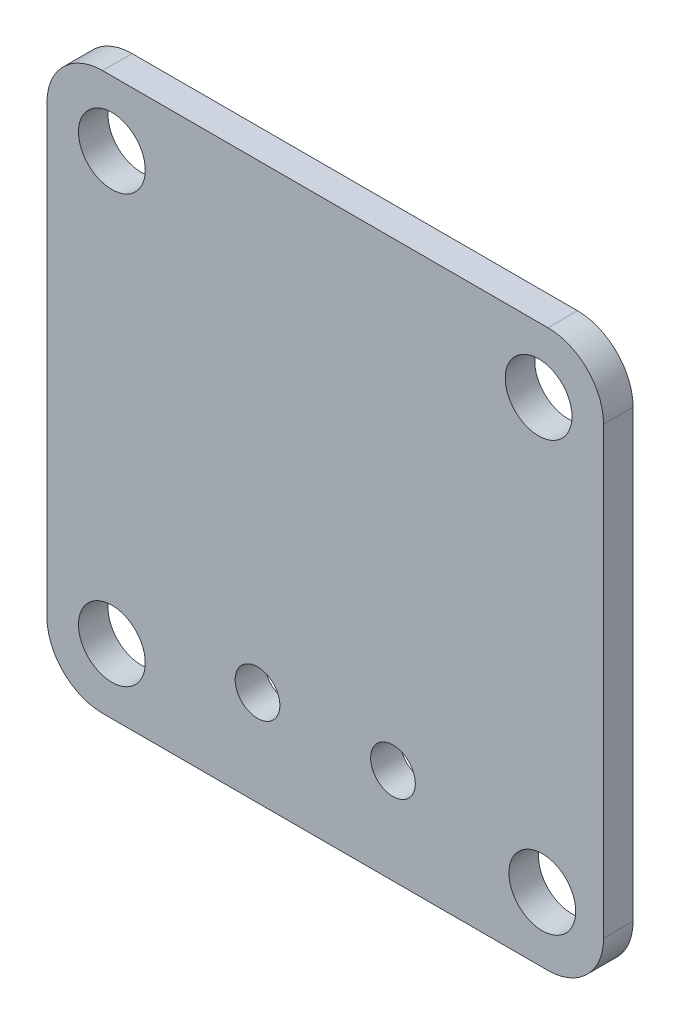
ISO-10303-21;
HEADER;
FILE_DESCRIPTION(('STEP AP214'),'2;1');
FILE_NAME('part.step','',(''),(''),'','','');
FILE_SCHEMA(('AUTOMOTIVE_DESIGN { 1 0 10303 214 1 1 1 1 }'));
ENDSEC;
DATA;
#1=APPLICATION_CONTEXT('core data for automotive mechanical design processes');
#2=APPLICATION_PROTOCOL_DEFINITION('international standard','automotive_design',2000,#1);
#3=PRODUCT_CONTEXT('',#1,'mechanical');
#4=PRODUCT('Part','Part','',(#3));
#5=PRODUCT_RELATED_PRODUCT_CATEGORY('part','',(#4));
#6=PRODUCT_DEFINITION_FORMATION('','',#4);
#7=PRODUCT_DEFINITION_CONTEXT('part definition',#1,'design');
#8=PRODUCT_DEFINITION('design','',#6,#7);
#9=PRODUCT_DEFINITION_SHAPE('','',#8);
#10=(LENGTH_UNIT() NAMED_UNIT(*) SI_UNIT(.MILLI.,.METRE.));
#11=(NAMED_UNIT(*) PLANE_ANGLE_UNIT() SI_UNIT($,.RADIAN.));
#12=(NAMED_UNIT(*) SI_UNIT($,.STERADIAN.) SOLID_ANGLE_UNIT());
#13=UNCERTAINTY_MEASURE_WITH_UNIT(LENGTH_MEASURE(1.E-05),#10,'distance_accuracy_value','');
#14=(GEOMETRIC_REPRESENTATION_CONTEXT(3) GLOBAL_UNCERTAINTY_ASSIGNED_CONTEXT((#13)) GLOBAL_UNIT_ASSIGNED_CONTEXT((#10,
#11,#12)) REPRESENTATION_CONTEXT('',''));
#15=CARTESIAN_POINT('',(0.,0.,0.));
#16=DIRECTION('',(0.,0.,1.));
#17=DIRECTION('',(1.,0.,0.));
#18=AXIS2_PLACEMENT_3D('',#15,#16,#17);
#19=CARTESIAN_POINT('',(79.,66.5,1.59143954));
#20=DIRECTION('',(0.,0.,-1.));
#21=DIRECTION('',(0.,-1.,0.));
#22=AXIS2_PLACEMENT_3D('',#19,#20,#21);
#23=PLANE('',#22);
#24=CARTESIAN_POINT('',(90.5,78.,1.59143954));
#25=DIRECTION('',(0.,0.,1.));
#26=DIRECTION('',(1.,0.,0.));
#27=AXIS2_PLACEMENT_3D('',#24,#25,#26);
#28=CIRCLE('',#27,1.8);
#29=CARTESIAN_POINT('',(92.3,78.,1.59143954));
#30=VERTEX_POINT('',#29);
#31=EDGE_CURVE('E21',#30,#30,#28,.T.);
#32=ORIENTED_EDGE('',*,*,#31,.F.);
#33=EDGE_LOOP('',(#32));
#34=FACE_BOUND('',#33,.T.);
#35=CARTESIAN_POINT('',(82.65,56.645,1.59143954));
#36=DIRECTION('',(0.,0.,1.));
#37=DIRECTION('',(1.,0.,0.));
#38=AXIS2_PLACEMENT_3D('',#35,#36,#37);
#39=CIRCLE('',#38,1.205);
#40=CARTESIAN_POINT('',(83.855,56.645,1.59143954));
#41=VERTEX_POINT('',#40);
#42=EDGE_CURVE('E234',#41,#41,#39,.T.);
#43=ORIENTED_EDGE('',*,*,#42,.F.);
#44=EDGE_LOOP('',(#43));
#45=FACE_BOUND('',#44,.T.);
#46=CARTESIAN_POINT('',(90.7,55.,1.59143954));
#47=DIRECTION('',(0.,0.,1.));
#48=DIRECTION('',(1.,0.,0.));
#49=AXIS2_PLACEMENT_3D('',#46,#47,#48);
#50=CIRCLE('',#49,1.8);
#51=CARTESIAN_POINT('',(92.5,55.,1.59143954));
#52=VERTEX_POINT('',#51);
#53=EDGE_CURVE('E227',#52,#52,#50,.T.);
#54=ORIENTED_EDGE('',*,*,#53,.F.);
#55=EDGE_LOOP('',(#54));
#56=FACE_BOUND('',#55,.T.);
#57=CARTESIAN_POINT('',(75.35,56.645,1.59143954));
#58=DIRECTION('',(0.,0.,1.));
#59=DIRECTION('',(1.,0.,0.));
#60=AXIS2_PLACEMENT_3D('',#57,#58,#59);
#61=CIRCLE('',#60,1.205);
#62=CARTESIAN_POINT('',(76.555,56.645,1.59143954));
#63=VERTEX_POINT('',#62);
#64=EDGE_CURVE('E201',#63,#63,#61,.T.);
#65=ORIENTED_EDGE('',*,*,#64,.F.);
#66=EDGE_LOOP('',(#65));
#67=FACE_BOUND('',#66,.T.);
#68=CARTESIAN_POINT('',(67.5,78.,1.59143954));
#69=DIRECTION('',(0.,0.,1.));
#70=DIRECTION('',(1.,0.,0.));
#71=AXIS2_PLACEMENT_3D('',#68,#69,#70);
#72=CIRCLE('',#71,1.8);
#73=CARTESIAN_POINT('',(69.3,78.,1.59143954));
#74=VERTEX_POINT('',#73);
#75=EDGE_CURVE('E202',#74,#74,#72,.T.);
#76=ORIENTED_EDGE('',*,*,#75,.F.);
#77=EDGE_LOOP('',(#76));
#78=FACE_BOUND('',#77,.T.);
#79=CARTESIAN_POINT('',(67.5,55.,1.59143954));
#80=DIRECTION('',(0.,0.,1.));
#81=DIRECTION('',(1.,0.,0.));
#82=AXIS2_PLACEMENT_3D('',#79,#80,#81);
#83=CIRCLE('',#82,1.8);
#84=CARTESIAN_POINT('',(69.3,55.,1.59143954));
#85=VERTEX_POINT('',#84);
#86=EDGE_CURVE('E120',#85,#85,#83,.T.);
#87=ORIENTED_EDGE('',*,*,#86,.F.);
#88=EDGE_LOOP('',(#87));
#89=FACE_BOUND('',#88,.T.);
#90=CARTESIAN_POINT('',(67.001094202899,54.501094202899,1.59143954));
#91=DIRECTION('',(0.,0.,-1.));
#92=DIRECTION('',(-0.000364601292683781,-0.999999933532946,0.));
#93=AXIS2_PLACEMENT_3D('',#90,#91,#92);
#94=CIRCLE('',#93,3.001094402372);
#95=CARTESIAN_POINT('',(67.,51.5,1.59143954));
#96=VERTEX_POINT('',#95);
#97=CARTESIAN_POINT('',(64.,54.5,1.59143954));
#98=VERTEX_POINT('',#97);
#99=EDGE_CURVE('E111',#96,#98,#94,.T.);
#100=ORIENTED_EDGE('',*,*,#99,.F.);
#101=DIRECTION('',(-1.,0.,0.));
#102=VECTOR('',#101,1.);
#103=CARTESIAN_POINT('',(91.,51.5,1.59143954));
#104=LINE('',#103,#102);
#105=CARTESIAN_POINT('',(91.,51.5,1.59143954));
#106=VERTEX_POINT('',#105);
#107=EDGE_CURVE('E89',#106,#96,#104,.T.);
#108=ORIENTED_EDGE('',*,*,#107,.F.);
#109=CARTESIAN_POINT('',(90.998905797101,54.501094202899,1.59143954));
#110=DIRECTION('',(0.,0.,-1.));
#111=DIRECTION('',(0.999999933532946,-0.000364601292678981,0.));
#112=AXIS2_PLACEMENT_3D('',#109,#110,#111);
#113=CIRCLE('',#112,3.001094402372);
#114=CARTESIAN_POINT('',(94.,54.5,1.59143954));
#115=VERTEX_POINT('',#114);
#116=EDGE_CURVE('E160',#115,#106,#113,.T.);
#117=ORIENTED_EDGE('',*,*,#116,.F.);
#118=DIRECTION('',(0.,-1.,0.));
#119=VECTOR('',#118,1.);
#120=CARTESIAN_POINT('',(94.,78.5,1.59143954));
#121=LINE('',#120,#119);
#122=CARTESIAN_POINT('',(94.,78.5,1.59143954));
#123=VERTEX_POINT('',#122);
#124=EDGE_CURVE('E150',#123,#115,#121,.T.);
#125=ORIENTED_EDGE('',*,*,#124,.F.);
#126=CARTESIAN_POINT('',(90.998905797101,78.498905797101,1.59143954));
#127=DIRECTION('',(0.,0.,-1.));
#128=DIRECTION('',(0.000364601292683781,0.999999933532946,0.));
#129=AXIS2_PLACEMENT_3D('',#126,#127,#128);
#130=CIRCLE('',#129,3.001094402372);
#131=CARTESIAN_POINT('',(91.,81.5,1.59143954));
#132=VERTEX_POINT('',#131);
#133=EDGE_CURVE('E187',#132,#123,#130,.T.);
#134=ORIENTED_EDGE('',*,*,#133,.F.);
#135=DIRECTION('',(1.,0.,0.));
#136=VECTOR('',#135,1.);
#137=CARTESIAN_POINT('',(67.,81.5,1.59143954));
#138=LINE('',#137,#136);
#139=CARTESIAN_POINT('',(67.,81.5,1.59143954));
#140=VERTEX_POINT('',#139);
#141=EDGE_CURVE('E142',#140,#132,#138,.T.);
#142=ORIENTED_EDGE('',*,*,#141,.F.);
#143=CARTESIAN_POINT('',(67.001094202899,78.498905797101,1.59143954));
#144=DIRECTION('',(0.,0.,-1.));
#145=DIRECTION('',(-0.999999933532946,0.000364601292683781,0.));
#146=AXIS2_PLACEMENT_3D('',#143,#144,#145);
#147=CIRCLE('',#146,3.001094402372);
#148=CARTESIAN_POINT('',(64.,78.5,1.59143954));
#149=VERTEX_POINT('',#148);
#150=EDGE_CURVE('E102',#149,#140,#147,.T.);
#151=ORIENTED_EDGE('',*,*,#150,.F.);
#152=DIRECTION('',(0.,1.,0.));
#153=VECTOR('',#152,1.);
#154=CARTESIAN_POINT('',(64.,54.5,1.59143954));
#155=LINE('',#154,#153);
#156=EDGE_CURVE('E132',#98,#149,#155,.T.);
#157=ORIENTED_EDGE('',*,*,#156,.F.);
#158=EDGE_LOOP('',(#100,#108,#117,#125,#134,#142,#151,#157));
#159=FACE_BOUND('',#158,.T.);
#160=ADVANCED_FACE('F17',(#34,#45,#56,#67,#78,#89,#159),#23,.F.);
#161=CARTESIAN_POINT('',(79.,66.5,0.));
#162=DIRECTION('',(0.,0.,-1.));
#163=DIRECTION('',(0.,-1.,0.));
#164=AXIS2_PLACEMENT_3D('',#161,#162,#163);
#165=PLANE('',#164);
#166=CARTESIAN_POINT('',(90.5,78.,0.));
#167=DIRECTION('',(0.,0.,1.));
#168=DIRECTION('',(1.,0.,0.));
#169=AXIS2_PLACEMENT_3D('',#166,#167,#168);
#170=CIRCLE('',#169,1.8);
#171=CARTESIAN_POINT('',(92.3,78.,0.));
#172=VERTEX_POINT('',#171);
#173=EDGE_CURVE('E11',#172,#172,#170,.T.);
#174=ORIENTED_EDGE('',*,*,#173,.T.);
#175=EDGE_LOOP('',(#174));
#176=FACE_BOUND('',#175,.T.);
#177=CARTESIAN_POINT('',(82.65,56.645,0.));
#178=DIRECTION('',(0.,0.,1.));
#179=DIRECTION('',(1.,0.,0.));
#180=AXIS2_PLACEMENT_3D('',#177,#178,#179);
#181=CIRCLE('',#180,1.205);
#182=CARTESIAN_POINT('',(83.855,56.645,0.));
#183=VERTEX_POINT('',#182);
#184=EDGE_CURVE('E238',#183,#183,#181,.T.);
#185=ORIENTED_EDGE('',*,*,#184,.T.);
#186=EDGE_LOOP('',(#185));
#187=FACE_BOUND('',#186,.T.);
#188=CARTESIAN_POINT('',(90.7,55.,0.));
#189=DIRECTION('',(0.,0.,1.));
#190=DIRECTION('',(1.,0.,0.));
#191=AXIS2_PLACEMENT_3D('',#188,#189,#190);
#192=CIRCLE('',#191,1.8);
#193=CARTESIAN_POINT('',(92.5,55.,0.));
#194=VERTEX_POINT('',#193);
#195=EDGE_CURVE('E231',#194,#194,#192,.T.);
#196=ORIENTED_EDGE('',*,*,#195,.T.);
#197=EDGE_LOOP('',(#196));
#198=FACE_BOUND('',#197,.T.);
#199=CARTESIAN_POINT('',(75.35,56.645,0.));
#200=DIRECTION('',(0.,0.,1.));
#201=DIRECTION('',(1.,0.,0.));
#202=AXIS2_PLACEMENT_3D('',#199,#200,#201);
#203=CIRCLE('',#202,1.205);
#204=CARTESIAN_POINT('',(76.555,56.645,0.));
#205=VERTEX_POINT('',#204);
#206=EDGE_CURVE('E223',#205,#205,#203,.T.);
#207=ORIENTED_EDGE('',*,*,#206,.T.);
#208=EDGE_LOOP('',(#207));
#209=FACE_BOUND('',#208,.T.);
#210=CARTESIAN_POINT('',(67.5,78.,0.));
#211=DIRECTION('',(0.,0.,1.));
#212=DIRECTION('',(1.,0.,0.));
#213=AXIS2_PLACEMENT_3D('',#210,#211,#212);
#214=CIRCLE('',#213,1.8);
#215=CARTESIAN_POINT('',(69.3,78.,0.));
#216=VERTEX_POINT('',#215);
#217=EDGE_CURVE('E197',#216,#216,#214,.T.);
#218=ORIENTED_EDGE('',*,*,#217,.T.);
#219=EDGE_LOOP('',(#218));
#220=FACE_BOUND('',#219,.T.);
#221=CARTESIAN_POINT('',(67.5,55.,0.));
#222=DIRECTION('',(0.,0.,1.));
#223=DIRECTION('',(1.,0.,0.));
#224=AXIS2_PLACEMENT_3D('',#221,#222,#223);
#225=CIRCLE('',#224,1.8);
#226=CARTESIAN_POINT('',(69.3,55.,0.));
#227=VERTEX_POINT('',#226);
#228=EDGE_CURVE('E140',#227,#227,#225,.T.);
#229=ORIENTED_EDGE('',*,*,#228,.T.);
#230=EDGE_LOOP('',(#229));
#231=FACE_BOUND('',#230,.T.);
#232=DIRECTION('',(0.,1.,0.));
#233=VECTOR('',#232,1.);
#234=CARTESIAN_POINT('',(64.,54.5,0.));
#235=LINE('',#234,#233);
#236=CARTESIAN_POINT('',(64.,54.5,0.));
#237=VERTEX_POINT('',#236);
#238=CARTESIAN_POINT('',(64.,78.5,0.));
#239=VERTEX_POINT('',#238);
#240=EDGE_CURVE('E117',#237,#239,#235,.T.);
#241=ORIENTED_EDGE('',*,*,#240,.T.);
#242=CARTESIAN_POINT('',(67.001094202899,78.498905797101,0.));
#243=DIRECTION('',(0.,0.,-1.));
#244=DIRECTION('',(-0.999999933532946,0.000364601292683781,0.));
#245=AXIS2_PLACEMENT_3D('',#242,#243,#244);
#246=CIRCLE('',#245,3.001094402372);
#247=CARTESIAN_POINT('',(67.,81.5,0.));
#248=VERTEX_POINT('',#247);
#249=EDGE_CURVE('E147',#239,#248,#246,.T.);
#250=ORIENTED_EDGE('',*,*,#249,.T.);
#251=DIRECTION('',(1.,0.,0.));
#252=VECTOR('',#251,1.);
#253=CARTESIAN_POINT('',(67.,81.5,0.));
#254=LINE('',#253,#252);
#255=CARTESIAN_POINT('',(91.,81.5,0.));
#256=VERTEX_POINT('',#255);
#257=EDGE_CURVE('E176',#248,#256,#254,.T.);
#258=ORIENTED_EDGE('',*,*,#257,.T.);
#259=CARTESIAN_POINT('',(90.998905797101,78.498905797101,0.));
#260=DIRECTION('',(0.,0.,-1.));
#261=DIRECTION('',(0.000364601292683781,0.999999933532946,0.));
#262=AXIS2_PLACEMENT_3D('',#259,#260,#261);
#263=CIRCLE('',#262,3.001094402372);
#264=CARTESIAN_POINT('',(94.,78.5,0.));
#265=VERTEX_POINT('',#264);
#266=EDGE_CURVE('E154',#256,#265,#263,.T.);
#267=ORIENTED_EDGE('',*,*,#266,.T.);
#268=DIRECTION('',(0.,-1.,0.));
#269=VECTOR('',#268,1.);
#270=CARTESIAN_POINT('',(94.,78.5,0.));
#271=LINE('',#270,#269);
#272=CARTESIAN_POINT('',(94.,54.5,0.));
#273=VERTEX_POINT('',#272);
#274=EDGE_CURVE('E164',#265,#273,#271,.T.);
#275=ORIENTED_EDGE('',*,*,#274,.T.);
#276=CARTESIAN_POINT('',(90.998905797101,54.501094202899,0.));
#277=DIRECTION('',(0.,0.,-1.));
#278=DIRECTION('',(0.999999933532946,-0.000364601292678981,0.));
#279=AXIS2_PLACEMENT_3D('',#276,#277,#278);
#280=CIRCLE('',#279,3.001094402372);
#281=CARTESIAN_POINT('',(91.,51.5,0.));
#282=VERTEX_POINT('',#281);
#283=EDGE_CURVE('E159',#273,#282,#280,.T.);
#284=ORIENTED_EDGE('',*,*,#283,.T.);
#285=DIRECTION('',(-1.,0.,0.));
#286=VECTOR('',#285,1.);
#287=CARTESIAN_POINT('',(91.,51.5,0.));
#288=LINE('',#287,#286);
#289=CARTESIAN_POINT('',(67.,51.5,0.));
#290=VERTEX_POINT('',#289);
#291=EDGE_CURVE('E78',#282,#290,#288,.T.);
#292=ORIENTED_EDGE('',*,*,#291,.T.);
#293=CARTESIAN_POINT('',(67.001094202899,54.501094202899,0.));
#294=DIRECTION('',(0.,0.,-1.));
#295=DIRECTION('',(-0.000364601292683781,-0.999999933532946,0.));
#296=AXIS2_PLACEMENT_3D('',#293,#294,#295);
#297=CIRCLE('',#296,3.001094402372);
#298=EDGE_CURVE('E41',#290,#237,#297,.T.);
#299=ORIENTED_EDGE('',*,*,#298,.T.);
#300=EDGE_LOOP('',(#241,#250,#258,#267,#275,#284,#292,#299));
#301=FACE_BOUND('',#300,.T.);
#302=ADVANCED_FACE('F19',(#176,#187,#198,#209,#220,#231,#301),#165,.T.);
#303=CARTESIAN_POINT('',(90.5,78.,0.));
#304=DIRECTION('',(0.,0.,-1.));
#305=DIRECTION('',(1.,0.,0.));
#306=AXIS2_PLACEMENT_3D('',#303,#304,#305);
#307=CYLINDRICAL_SURFACE('',#306,1.8);
#308=ORIENTED_EDGE('',*,*,#31,.T.);
#309=EDGE_LOOP('',(#308));
#310=FACE_BOUND('',#309,.T.);
#311=ORIENTED_EDGE('',*,*,#173,.F.);
#312=EDGE_LOOP('',(#311));
#313=FACE_BOUND('',#312,.T.);
#314=ADVANCED_FACE('F251',(#310,#313),#307,.F.);
#315=CARTESIAN_POINT('',(82.65,56.645,0.));
#316=DIRECTION('',(0.,0.,-1.));
#317=DIRECTION('',(1.,0.,0.));
#318=AXIS2_PLACEMENT_3D('',#315,#316,#317);
#319=CYLINDRICAL_SURFACE('',#318,1.205);
#320=ORIENTED_EDGE('',*,*,#42,.T.);
#321=EDGE_LOOP('',(#320));
#322=FACE_BOUND('',#321,.T.);
#323=ORIENTED_EDGE('',*,*,#184,.F.);
#324=EDGE_LOOP('',(#323));
#325=FACE_BOUND('',#324,.T.);
#326=ADVANCED_FACE('F358',(#322,#325),#319,.F.);
#327=CARTESIAN_POINT('',(90.7,55.,0.));
#328=DIRECTION('',(0.,0.,-1.));
#329=DIRECTION('',(1.,0.,0.));
#330=AXIS2_PLACEMENT_3D('',#327,#328,#329);
#331=CYLINDRICAL_SURFACE('',#330,1.8);
#332=ORIENTED_EDGE('',*,*,#53,.T.);
#333=EDGE_LOOP('',(#332));
#334=FACE_BOUND('',#333,.T.);
#335=ORIENTED_EDGE('',*,*,#195,.F.);
#336=EDGE_LOOP('',(#335));
#337=FACE_BOUND('',#336,.T.);
#338=ADVANCED_FACE('F355',(#334,#337),#331,.F.);
#339=CARTESIAN_POINT('',(75.35,56.645,0.));
#340=DIRECTION('',(0.,0.,-1.));
#341=DIRECTION('',(1.,0.,0.));
#342=AXIS2_PLACEMENT_3D('',#339,#340,#341);
#343=CYLINDRICAL_SURFACE('',#342,1.205);
#344=ORIENTED_EDGE('',*,*,#64,.T.);
#345=EDGE_LOOP('',(#344));
#346=FACE_BOUND('',#345,.T.);
#347=ORIENTED_EDGE('',*,*,#206,.F.);
#348=EDGE_LOOP('',(#347));
#349=FACE_BOUND('',#348,.T.);
#350=ADVANCED_FACE('F354',(#346,#349),#343,.F.);
#351=CARTESIAN_POINT('',(67.5,78.,0.));
#352=DIRECTION('',(0.,0.,-1.));
#353=DIRECTION('',(1.,0.,0.));
#354=AXIS2_PLACEMENT_3D('',#351,#352,#353);
#355=CYLINDRICAL_SURFACE('',#354,1.8);
#356=ORIENTED_EDGE('',*,*,#75,.T.);
#357=EDGE_LOOP('',(#356));
#358=FACE_BOUND('',#357,.T.);
#359=ORIENTED_EDGE('',*,*,#217,.F.);
#360=EDGE_LOOP('',(#359));
#361=FACE_BOUND('',#360,.T.);
#362=ADVANCED_FACE('F371',(#358,#361),#355,.F.);
#363=CARTESIAN_POINT('',(67.5,55.,0.));
#364=DIRECTION('',(0.,0.,-1.));
#365=DIRECTION('',(1.,0.,0.));
#366=AXIS2_PLACEMENT_3D('',#363,#364,#365);
#367=CYLINDRICAL_SURFACE('',#366,1.8);
#368=ORIENTED_EDGE('',*,*,#86,.T.);
#369=EDGE_LOOP('',(#368));
#370=FACE_BOUND('',#369,.T.);
#371=ORIENTED_EDGE('',*,*,#228,.F.);
#372=EDGE_LOOP('',(#371));
#373=FACE_BOUND('',#372,.T.);
#374=ADVANCED_FACE('F368',(#370,#373),#367,.F.);
#375=CARTESIAN_POINT('',(67.001094202899,54.501094202899,0.));
#376=DIRECTION('',(0.,0.,-1.));
#377=DIRECTION('',(-0.000364601292683781,-0.999999933532946,0.));
#378=AXIS2_PLACEMENT_3D('',#375,#376,#377);
#379=CYLINDRICAL_SURFACE('',#378,3.001094402372);
#380=DIRECTION('',(0.,0.,1.));
#381=VECTOR('',#380,1.);
#382=CARTESIAN_POINT('',(67.,51.5,0.));
#383=LINE('',#382,#381);
#384=EDGE_CURVE('E181',#290,#96,#383,.T.);
#385=ORIENTED_EDGE('',*,*,#384,.T.);
#386=ORIENTED_EDGE('',*,*,#99,.T.);
#387=DIRECTION('',(0.,0.,1.));
#388=VECTOR('',#387,1.);
#389=CARTESIAN_POINT('',(64.,54.5,0.));
#390=LINE('',#389,#388);
#391=EDGE_CURVE('E126',#237,#98,#390,.T.);
#392=ORIENTED_EDGE('',*,*,#391,.F.);
#393=ORIENTED_EDGE('',*,*,#298,.F.);
#394=EDGE_LOOP('',(#385,#386,#392,#393));
#395=FACE_BOUND('',#394,.T.);
#396=ADVANCED_FACE('F130',(#395),#379,.T.);
#397=CARTESIAN_POINT('',(91.,51.5,0.));
#398=DIRECTION('',(0.,-1.,0.));
#399=DIRECTION('',(0.,0.,-1.));
#400=AXIS2_PLACEMENT_3D('',#397,#398,#399);
#401=PLANE('',#400);
#402=DIRECTION('',(0.,0.,1.));
#403=VECTOR('',#402,1.);
#404=CARTESIAN_POINT('',(91.,51.5,0.));
#405=LINE('',#404,#403);
#406=EDGE_CURVE('E156',#282,#106,#405,.T.);
#407=ORIENTED_EDGE('',*,*,#406,.T.);
#408=ORIENTED_EDGE('',*,*,#107,.T.);
#409=ORIENTED_EDGE('',*,*,#384,.F.);
#410=ORIENTED_EDGE('',*,*,#291,.F.);
#411=EDGE_LOOP('',(#407,#408,#409,#410));
#412=FACE_BOUND('',#411,.T.);
#413=ADVANCED_FACE('F265',(#412),#401,.T.);
#414=CARTESIAN_POINT('',(90.998905797101,54.501094202899,0.));
#415=DIRECTION('',(0.,0.,-1.));
#416=DIRECTION('',(0.999999933532946,-0.000364601292678981,0.));
#417=AXIS2_PLACEMENT_3D('',#414,#415,#416);
#418=CYLINDRICAL_SURFACE('',#417,3.001094402372);
#419=DIRECTION('',(0.,0.,1.));
#420=VECTOR('',#419,1.);
#421=CARTESIAN_POINT('',(94.,54.5,0.));
#422=LINE('',#421,#420);
#423=EDGE_CURVE('E153',#273,#115,#422,.T.);
#424=ORIENTED_EDGE('',*,*,#423,.T.);
#425=ORIENTED_EDGE('',*,*,#116,.T.);
#426=ORIENTED_EDGE('',*,*,#406,.F.);
#427=ORIENTED_EDGE('',*,*,#283,.F.);
#428=EDGE_LOOP('',(#424,#425,#426,#427));
#429=FACE_BOUND('',#428,.T.);
#430=ADVANCED_FACE('F268',(#429),#418,.T.);
#431=CARTESIAN_POINT('',(94.,78.5,0.));
#432=DIRECTION('',(1.,0.,0.));
#433=DIRECTION('',(0.,1.,0.));
#434=AXIS2_PLACEMENT_3D('',#431,#432,#433);
#435=PLANE('',#434);
#436=DIRECTION('',(0.,0.,1.));
#437=VECTOR('',#436,1.);
#438=CARTESIAN_POINT('',(94.,78.5,0.));
#439=LINE('',#438,#437);
#440=EDGE_CURVE('E180',#265,#123,#439,.T.);
#441=ORIENTED_EDGE('',*,*,#440,.T.);
#442=ORIENTED_EDGE('',*,*,#124,.T.);
#443=ORIENTED_EDGE('',*,*,#423,.F.);
#444=ORIENTED_EDGE('',*,*,#274,.F.);
#445=EDGE_LOOP('',(#441,#442,#443,#444));
#446=FACE_BOUND('',#445,.T.);
#447=ADVANCED_FACE('F273',(#446),#435,.T.);
#448=CARTESIAN_POINT('',(90.998905797101,78.498905797101,0.));
#449=DIRECTION('',(0.,0.,-1.));
#450=DIRECTION('',(0.000364601292683781,0.999999933532946,0.));
#451=AXIS2_PLACEMENT_3D('',#448,#449,#450);
#452=CYLINDRICAL_SURFACE('',#451,3.001094402372);
#453=DIRECTION('',(0.,0.,1.));
#454=VECTOR('',#453,1.);
#455=CARTESIAN_POINT('',(91.,81.5,0.));
#456=LINE('',#455,#454);
#457=EDGE_CURVE('E146',#256,#132,#456,.T.);
#458=ORIENTED_EDGE('',*,*,#457,.T.);
#459=ORIENTED_EDGE('',*,*,#133,.T.);
#460=ORIENTED_EDGE('',*,*,#440,.F.);
#461=ORIENTED_EDGE('',*,*,#266,.F.);
#462=EDGE_LOOP('',(#458,#459,#460,#461));
#463=FACE_BOUND('',#462,.T.);
#464=ADVANCED_FACE('F275',(#463),#452,.T.);
#465=CARTESIAN_POINT('',(67.,81.5,0.));
#466=DIRECTION('',(0.,1.,0.));
#467=DIRECTION('',(1.,0.,0.));
#468=AXIS2_PLACEMENT_3D('',#465,#466,#467);
#469=PLANE('',#468);
#470=DIRECTION('',(0.,0.,1.));
#471=VECTOR('',#470,1.);
#472=CARTESIAN_POINT('',(67.,81.5,0.));
#473=LINE('',#472,#471);
#474=EDGE_CURVE('E167',#248,#140,#473,.T.);
#475=ORIENTED_EDGE('',*,*,#474,.T.);
#476=ORIENTED_EDGE('',*,*,#141,.T.);
#477=ORIENTED_EDGE('',*,*,#457,.F.);
#478=ORIENTED_EDGE('',*,*,#257,.F.);
#479=EDGE_LOOP('',(#475,#476,#477,#478));
#480=FACE_BOUND('',#479,.T.);
#481=ADVANCED_FACE('F278',(#480),#469,.T.);
#482=CARTESIAN_POINT('',(67.001094202899,78.498905797101,0.));
#483=DIRECTION('',(0.,0.,-1.));
#484=DIRECTION('',(-0.999999933532946,0.000364601292683781,0.));
#485=AXIS2_PLACEMENT_3D('',#482,#483,#484);
#486=CYLINDRICAL_SURFACE('',#485,3.001094402372);
#487=DIRECTION('',(0.,0.,1.));
#488=VECTOR('',#487,1.);
#489=CARTESIAN_POINT('',(64.,78.5,0.));
#490=LINE('',#489,#488);
#491=EDGE_CURVE('E127',#239,#149,#490,.T.);
#492=ORIENTED_EDGE('',*,*,#491,.T.);
#493=ORIENTED_EDGE('',*,*,#150,.T.);
#494=ORIENTED_EDGE('',*,*,#474,.F.);
#495=ORIENTED_EDGE('',*,*,#249,.F.);
#496=EDGE_LOOP('',(#492,#493,#494,#495));
#497=FACE_BOUND('',#496,.T.);
#498=ADVANCED_FACE('F284',(#497),#486,.T.);
#499=CARTESIAN_POINT('',(64.,54.5,0.));
#500=DIRECTION('',(-1.,0.,0.));
#501=DIRECTION('',(0.,0.,1.));
#502=AXIS2_PLACEMENT_3D('',#499,#500,#501);
#503=PLANE('',#502);
#504=ORIENTED_EDGE('',*,*,#391,.T.);
#505=ORIENTED_EDGE('',*,*,#156,.T.);
#506=ORIENTED_EDGE('',*,*,#491,.F.);
#507=ORIENTED_EDGE('',*,*,#240,.F.);
#508=EDGE_LOOP('',(#504,#505,#506,#507));
#509=FACE_BOUND('',#508,.T.);
#510=ADVANCED_FACE('F124',(#509),#503,.T.);
#511=CLOSED_SHELL('',(#160,#302,#314,#326,#338,#350,#362,#374,#396,#413,#430,#447,#464,#481,
#498,#510));
#512=MANIFOLD_SOLID_BREP('B1',#511);
#513=ADVANCED_BREP_SHAPE_REPRESENTATION('',(#18,#512),#14);
#514=SHAPE_DEFINITION_REPRESENTATION(#9,#513);
ENDSEC;
END-ISO-10303-21;
